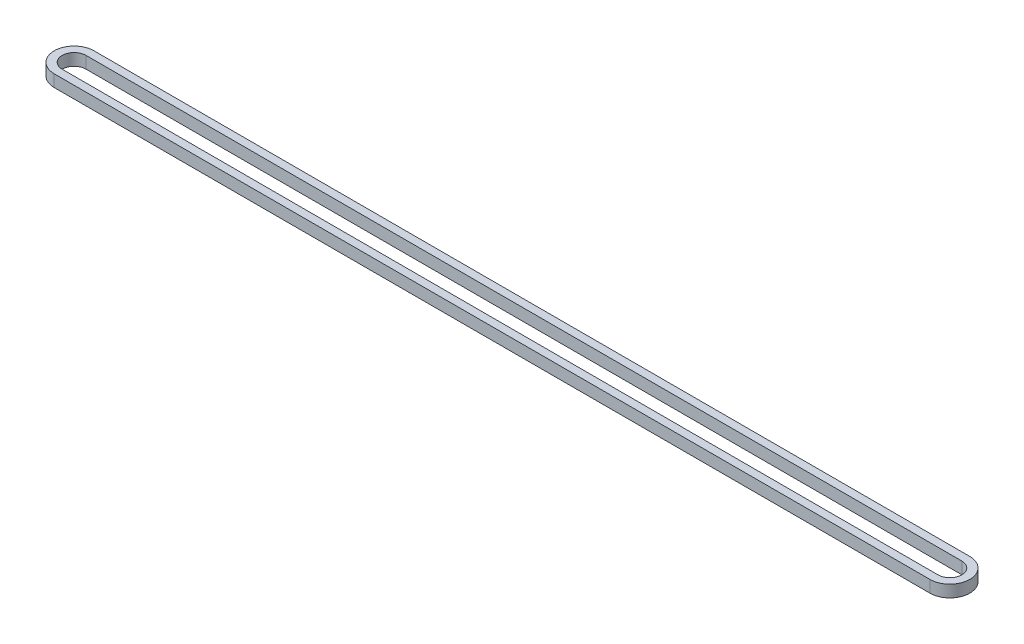
ISO-10303-21;
HEADER;
FILE_DESCRIPTION(('STEP AP214'),'2;1');
FILE_NAME('part.step','',(''),(''),'','','');
FILE_SCHEMA(('AUTOMOTIVE_DESIGN { 1 0 10303 214 1 1 1 1 }'));
ENDSEC;
DATA;
#1=APPLICATION_CONTEXT('core data for automotive mechanical design processes');
#2=APPLICATION_PROTOCOL_DEFINITION('international standard','automotive_design',2000,#1);
#3=PRODUCT_CONTEXT('',#1,'mechanical');
#4=PRODUCT('Part','Part','',(#3));
#5=PRODUCT_RELATED_PRODUCT_CATEGORY('part','',(#4));
#6=PRODUCT_DEFINITION_FORMATION('','',#4);
#7=PRODUCT_DEFINITION_CONTEXT('part definition',#1,'design');
#8=PRODUCT_DEFINITION('design','',#6,#7);
#9=PRODUCT_DEFINITION_SHAPE('','',#8);
#10=(LENGTH_UNIT() NAMED_UNIT(*) SI_UNIT(.MILLI.,.METRE.));
#11=(NAMED_UNIT(*) PLANE_ANGLE_UNIT() SI_UNIT($,.RADIAN.));
#12=(NAMED_UNIT(*) SI_UNIT($,.STERADIAN.) SOLID_ANGLE_UNIT());
#13=UNCERTAINTY_MEASURE_WITH_UNIT(LENGTH_MEASURE(1.E-05),#10,'distance_accuracy_value','');
#14=(GEOMETRIC_REPRESENTATION_CONTEXT(3) GLOBAL_UNCERTAINTY_ASSIGNED_CONTEXT((#13)) GLOBAL_UNIT_ASSIGNED_CONTEXT((#10,
#11,#12)) REPRESENTATION_CONTEXT('',''));
#15=CARTESIAN_POINT('',(0.,0.,0.));
#16=DIRECTION('',(0.,0.,1.));
#17=DIRECTION('',(1.,0.,0.));
#18=AXIS2_PLACEMENT_3D('',#15,#16,#17);
#19=CARTESIAN_POINT('',(0.,3.,0.));
#20=DIRECTION('',(0.,1.,0.));
#21=DIRECTION('',(0.,0.,1.));
#22=AXIS2_PLACEMENT_3D('',#19,#20,#21);
#23=PLANE('',#22);
#24=CARTESIAN_POINT('',(0.,3.,0.));
#25=DIRECTION('',(0.,1.,0.));
#26=DIRECTION('',(1.,0.,0.));
#27=AXIS2_PLACEMENT_3D('',#24,#25,#26);
#28=CIRCLE('',#27,5.);
#29=CARTESIAN_POINT('',(0.,3.,-5.));
#30=VERTEX_POINT('',#29);
#31=CARTESIAN_POINT('',(0.,3.,5.));
#32=VERTEX_POINT('',#31);
#33=EDGE_CURVE('E166',#30,#32,#28,.T.);
#34=ORIENTED_EDGE('',*,*,#33,.T.);
#35=DIRECTION('',(1.,0.,0.));
#36=VECTOR('',#35,1.);
#37=CARTESIAN_POINT('',(0.,3.,5.));
#38=LINE('',#37,#36);
#39=CARTESIAN_POINT('',(220.,3.,5.));
#40=VERTEX_POINT('',#39);
#41=EDGE_CURVE('E169',#32,#40,#38,.T.);
#42=ORIENTED_EDGE('',*,*,#41,.T.);
#43=CARTESIAN_POINT('',(220.,3.,0.));
#44=DIRECTION('',(0.,1.,0.));
#45=DIRECTION('',(1.,0.,0.));
#46=AXIS2_PLACEMENT_3D('',#43,#44,#45);
#47=CIRCLE('',#46,5.);
#48=CARTESIAN_POINT('',(220.,3.,-5.));
#49=VERTEX_POINT('',#48);
#50=EDGE_CURVE('E172',#40,#49,#47,.T.);
#51=ORIENTED_EDGE('',*,*,#50,.T.);
#52=DIRECTION('',(-1.,0.,0.));
#53=VECTOR('',#52,1.);
#54=CARTESIAN_POINT('',(0.,3.,-5.));
#55=LINE('',#54,#53);
#56=EDGE_CURVE('E174',#49,#30,#55,.T.);
#57=ORIENTED_EDGE('',*,*,#56,.T.);
#58=EDGE_LOOP('',(#34,#42,#51,#57));
#59=FACE_BOUND('',#58,.T.);
#60=DIRECTION('',(1.,0.,0.));
#61=VECTOR('',#60,1.);
#62=CARTESIAN_POINT('',(0.,3.,3.));
#63=LINE('',#62,#61);
#64=CARTESIAN_POINT('',(0.,3.,3.));
#65=VERTEX_POINT('',#64);
#66=CARTESIAN_POINT('',(220.,3.,3.));
#67=VERTEX_POINT('',#66);
#68=EDGE_CURVE('E138',#65,#67,#63,.T.);
#69=ORIENTED_EDGE('',*,*,#68,.F.);
#70=CARTESIAN_POINT('',(0.,3.,0.));
#71=DIRECTION('',(0.,1.,0.));
#72=DIRECTION('',(0.,0.,1.));
#73=AXIS2_PLACEMENT_3D('',#70,#71,#72);
#74=CIRCLE('',#73,3.);
#75=CARTESIAN_POINT('',(0.,3.,-3.));
#76=VERTEX_POINT('',#75);
#77=EDGE_CURVE('E130',#76,#65,#74,.T.);
#78=ORIENTED_EDGE('',*,*,#77,.F.);
#79=DIRECTION('',(-1.,0.,0.));
#80=VECTOR('',#79,1.);
#81=CARTESIAN_POINT('',(0.,3.,-3.));
#82=LINE('',#81,#80);
#83=CARTESIAN_POINT('',(220.,3.,-3.));
#84=VERTEX_POINT('',#83);
#85=EDGE_CURVE('E152',#84,#76,#82,.T.);
#86=ORIENTED_EDGE('',*,*,#85,.F.);
#87=CARTESIAN_POINT('',(220.,3.,0.));
#88=DIRECTION('',(0.,1.,0.));
#89=DIRECTION('',(0.,0.,1.));
#90=AXIS2_PLACEMENT_3D('',#87,#88,#89);
#91=CIRCLE('',#90,3.);
#92=EDGE_CURVE('E150',#67,#84,#91,.T.);
#93=ORIENTED_EDGE('',*,*,#92,.F.);
#94=EDGE_LOOP('',(#69,#78,#86,#93));
#95=FACE_BOUND('',#94,.T.);
#96=ADVANCED_FACE('F65',(#59,#95),#23,.T.);
#97=CARTESIAN_POINT('',(0.,0.,0.));
#98=DIRECTION('',(0.,1.,0.));
#99=DIRECTION('',(0.,0.,1.));
#100=AXIS2_PLACEMENT_3D('',#97,#98,#99);
#101=PLANE('',#100);
#102=CARTESIAN_POINT('',(0.,0.,0.));
#103=DIRECTION('',(0.,1.,0.));
#104=DIRECTION('',(1.,0.,0.));
#105=AXIS2_PLACEMENT_3D('',#102,#103,#104);
#106=CIRCLE('',#105,5.);
#107=CARTESIAN_POINT('',(0.,0.,-5.));
#108=VERTEX_POINT('',#107);
#109=CARTESIAN_POINT('',(0.,0.,5.));
#110=VERTEX_POINT('',#109);
#111=EDGE_CURVE('E146',#108,#110,#106,.T.);
#112=ORIENTED_EDGE('',*,*,#111,.F.);
#113=DIRECTION('',(-1.,0.,0.));
#114=VECTOR('',#113,1.);
#115=CARTESIAN_POINT('',(0.,0.,-5.));
#116=LINE('',#115,#114);
#117=CARTESIAN_POINT('',(220.,0.,-5.));
#118=VERTEX_POINT('',#117);
#119=EDGE_CURVE('E170',#118,#108,#116,.T.);
#120=ORIENTED_EDGE('',*,*,#119,.F.);
#121=CARTESIAN_POINT('',(220.,0.,0.));
#122=DIRECTION('',(0.,1.,0.));
#123=DIRECTION('',(1.,0.,0.));
#124=AXIS2_PLACEMENT_3D('',#121,#122,#123);
#125=CIRCLE('',#124,5.);
#126=CARTESIAN_POINT('',(220.,0.,5.));
#127=VERTEX_POINT('',#126);
#128=EDGE_CURVE('E181',#127,#118,#125,.T.);
#129=ORIENTED_EDGE('',*,*,#128,.F.);
#130=DIRECTION('',(1.,0.,0.));
#131=VECTOR('',#130,1.);
#132=CARTESIAN_POINT('',(0.,0.,5.));
#133=LINE('',#132,#131);
#134=EDGE_CURVE('E179',#110,#127,#133,.T.);
#135=ORIENTED_EDGE('',*,*,#134,.F.);
#136=EDGE_LOOP('',(#112,#120,#129,#135));
#137=FACE_BOUND('',#136,.T.);
#138=CARTESIAN_POINT('',(0.,0.,0.));
#139=DIRECTION('',(0.,1.,0.));
#140=DIRECTION('',(0.,0.,1.));
#141=AXIS2_PLACEMENT_3D('',#138,#139,#140);
#142=CIRCLE('',#141,3.);
#143=CARTESIAN_POINT('',(0.,0.,-3.));
#144=VERTEX_POINT('',#143);
#145=CARTESIAN_POINT('',(0.,0.,3.));
#146=VERTEX_POINT('',#145);
#147=EDGE_CURVE('E88',#144,#146,#142,.T.);
#148=ORIENTED_EDGE('',*,*,#147,.T.);
#149=DIRECTION('',(1.,0.,0.));
#150=VECTOR('',#149,1.);
#151=CARTESIAN_POINT('',(0.,0.,3.));
#152=LINE('',#151,#150);
#153=CARTESIAN_POINT('',(220.,0.,3.));
#154=VERTEX_POINT('',#153);
#155=EDGE_CURVE('E145',#146,#154,#152,.T.);
#156=ORIENTED_EDGE('',*,*,#155,.T.);
#157=CARTESIAN_POINT('',(220.,0.,0.));
#158=DIRECTION('',(0.,1.,0.));
#159=DIRECTION('',(0.,0.,1.));
#160=AXIS2_PLACEMENT_3D('',#157,#158,#159);
#161=CIRCLE('',#160,3.);
#162=CARTESIAN_POINT('',(220.,0.,-3.));
#163=VERTEX_POINT('',#162);
#164=EDGE_CURVE('E158',#154,#163,#161,.T.);
#165=ORIENTED_EDGE('',*,*,#164,.T.);
#166=DIRECTION('',(-1.,0.,0.));
#167=VECTOR('',#166,1.);
#168=CARTESIAN_POINT('',(0.,0.,-3.));
#169=LINE('',#168,#167);
#170=EDGE_CURVE('E139',#163,#144,#169,.T.);
#171=ORIENTED_EDGE('',*,*,#170,.T.);
#172=EDGE_LOOP('',(#148,#156,#165,#171));
#173=FACE_BOUND('',#172,.T.);
#174=ADVANCED_FACE('F199',(#137,#173),#101,.F.);
#175=CARTESIAN_POINT('',(0.,3.,0.));
#176=DIRECTION('',(0.,-1.,0.));
#177=DIRECTION('',(0.,0.,-1.));
#178=AXIS2_PLACEMENT_3D('',#175,#176,#177);
#179=CYLINDRICAL_SURFACE('',#178,5.);
#180=ORIENTED_EDGE('',*,*,#111,.T.);
#181=DIRECTION('',(0.,-1.,0.));
#182=VECTOR('',#181,1.);
#183=CARTESIAN_POINT('',(0.,3.,5.));
#184=LINE('',#183,#182);
#185=EDGE_CURVE('E12',#32,#110,#184,.T.);
#186=ORIENTED_EDGE('',*,*,#185,.F.);
#187=ORIENTED_EDGE('',*,*,#33,.F.);
#188=DIRECTION('',(0.,-1.,0.));
#189=VECTOR('',#188,1.);
#190=CARTESIAN_POINT('',(0.,3.,-5.));
#191=LINE('',#190,#189);
#192=EDGE_CURVE('E176',#30,#108,#191,.T.);
#193=ORIENTED_EDGE('',*,*,#192,.T.);
#194=EDGE_LOOP('',(#180,#186,#187,#193));
#195=FACE_BOUND('',#194,.T.);
#196=ADVANCED_FACE('F67',(#195),#179,.T.);
#197=CARTESIAN_POINT('',(0.,3.,5.));
#198=DIRECTION('',(0.,0.,-1.));
#199=DIRECTION('',(-1.,0.,0.));
#200=AXIS2_PLACEMENT_3D('',#197,#198,#199);
#201=PLANE('',#200);
#202=ORIENTED_EDGE('',*,*,#134,.T.);
#203=DIRECTION('',(0.,-1.,0.));
#204=VECTOR('',#203,1.);
#205=CARTESIAN_POINT('',(220.,3.,5.));
#206=LINE('',#205,#204);
#207=EDGE_CURVE('E73',#40,#127,#206,.T.);
#208=ORIENTED_EDGE('',*,*,#207,.F.);
#209=ORIENTED_EDGE('',*,*,#41,.F.);
#210=ORIENTED_EDGE('',*,*,#185,.T.);
#211=EDGE_LOOP('',(#202,#208,#209,#210));
#212=FACE_BOUND('',#211,.T.);
#213=ADVANCED_FACE('F209',(#212),#201,.F.);
#214=CARTESIAN_POINT('',(220.,3.,0.));
#215=DIRECTION('',(0.,-1.,0.));
#216=DIRECTION('',(0.,0.,-1.));
#217=AXIS2_PLACEMENT_3D('',#214,#215,#216);
#218=CYLINDRICAL_SURFACE('',#217,5.);
#219=ORIENTED_EDGE('',*,*,#128,.T.);
#220=DIRECTION('',(0.,-1.,0.));
#221=VECTOR('',#220,1.);
#222=CARTESIAN_POINT('',(220.,3.,-5.));
#223=LINE('',#222,#221);
#224=EDGE_CURVE('E186',#49,#118,#223,.T.);
#225=ORIENTED_EDGE('',*,*,#224,.F.);
#226=ORIENTED_EDGE('',*,*,#50,.F.);
#227=ORIENTED_EDGE('',*,*,#207,.T.);
#228=EDGE_LOOP('',(#219,#225,#226,#227));
#229=FACE_BOUND('',#228,.T.);
#230=ADVANCED_FACE('F193',(#229),#218,.T.);
#231=CARTESIAN_POINT('',(0.,3.,-5.));
#232=DIRECTION('',(0.,0.,1.));
#233=DIRECTION('',(1.,0.,0.));
#234=AXIS2_PLACEMENT_3D('',#231,#232,#233);
#235=PLANE('',#234);
#236=ORIENTED_EDGE('',*,*,#119,.T.);
#237=ORIENTED_EDGE('',*,*,#192,.F.);
#238=ORIENTED_EDGE('',*,*,#56,.F.);
#239=ORIENTED_EDGE('',*,*,#224,.T.);
#240=EDGE_LOOP('',(#236,#237,#238,#239));
#241=FACE_BOUND('',#240,.T.);
#242=ADVANCED_FACE('F203',(#241),#235,.F.);
#243=CARTESIAN_POINT('',(0.,3.,0.));
#244=DIRECTION('',(0.,-1.,0.));
#245=DIRECTION('',(0.,0.,-1.));
#246=AXIS2_PLACEMENT_3D('',#243,#244,#245);
#247=CYLINDRICAL_SURFACE('',#246,3.);
#248=ORIENTED_EDGE('',*,*,#147,.F.);
#249=DIRECTION('',(0.,-1.,0.));
#250=VECTOR('',#249,1.);
#251=CARTESIAN_POINT('',(0.,3.,-3.));
#252=LINE('',#251,#250);
#253=EDGE_CURVE('E134',#76,#144,#252,.T.);
#254=ORIENTED_EDGE('',*,*,#253,.F.);
#255=ORIENTED_EDGE('',*,*,#77,.T.);
#256=DIRECTION('',(0.,-1.,0.));
#257=VECTOR('',#256,1.);
#258=CARTESIAN_POINT('',(0.,3.,3.));
#259=LINE('',#258,#257);
#260=EDGE_CURVE('E133',#65,#146,#259,.T.);
#261=ORIENTED_EDGE('',*,*,#260,.T.);
#262=EDGE_LOOP('',(#248,#254,#255,#261));
#263=FACE_BOUND('',#262,.T.);
#264=ADVANCED_FACE('F132',(#263),#247,.F.);
#265=CARTESIAN_POINT('',(0.,3.,3.));
#266=DIRECTION('',(0.,0.,-1.));
#267=DIRECTION('',(-1.,0.,0.));
#268=AXIS2_PLACEMENT_3D('',#265,#266,#267);
#269=PLANE('',#268);
#270=ORIENTED_EDGE('',*,*,#155,.F.);
#271=ORIENTED_EDGE('',*,*,#260,.F.);
#272=ORIENTED_EDGE('',*,*,#68,.T.);
#273=DIRECTION('',(0.,-1.,0.));
#274=VECTOR('',#273,1.);
#275=CARTESIAN_POINT('',(220.,3.,3.));
#276=LINE('',#275,#274);
#277=EDGE_CURVE('E147',#67,#154,#276,.T.);
#278=ORIENTED_EDGE('',*,*,#277,.T.);
#279=EDGE_LOOP('',(#270,#271,#272,#278));
#280=FACE_BOUND('',#279,.T.);
#281=ADVANCED_FACE('F142',(#280),#269,.T.);
#282=CARTESIAN_POINT('',(220.,3.,0.));
#283=DIRECTION('',(0.,-1.,0.));
#284=DIRECTION('',(0.,0.,-1.));
#285=AXIS2_PLACEMENT_3D('',#282,#283,#284);
#286=CYLINDRICAL_SURFACE('',#285,3.);
#287=ORIENTED_EDGE('',*,*,#164,.F.);
#288=ORIENTED_EDGE('',*,*,#277,.F.);
#289=ORIENTED_EDGE('',*,*,#92,.T.);
#290=DIRECTION('',(0.,-1.,0.));
#291=VECTOR('',#290,1.);
#292=CARTESIAN_POINT('',(220.,3.,-3.));
#293=LINE('',#292,#291);
#294=EDGE_CURVE('E80',#84,#163,#293,.T.);
#295=ORIENTED_EDGE('',*,*,#294,.T.);
#296=EDGE_LOOP('',(#287,#288,#289,#295));
#297=FACE_BOUND('',#296,.T.);
#298=ADVANCED_FACE('F232',(#297),#286,.F.);
#299=CARTESIAN_POINT('',(0.,3.,-3.));
#300=DIRECTION('',(0.,0.,1.));
#301=DIRECTION('',(1.,0.,0.));
#302=AXIS2_PLACEMENT_3D('',#299,#300,#301);
#303=PLANE('',#302);
#304=ORIENTED_EDGE('',*,*,#170,.F.);
#305=ORIENTED_EDGE('',*,*,#294,.F.);
#306=ORIENTED_EDGE('',*,*,#85,.T.);
#307=ORIENTED_EDGE('',*,*,#253,.T.);
#308=EDGE_LOOP('',(#304,#305,#306,#307));
#309=FACE_BOUND('',#308,.T.);
#310=ADVANCED_FACE('F236',(#309),#303,.T.);
#311=CLOSED_SHELL('',(#96,#174,#196,#213,#230,#242,#264,#281,#298,#310));
#312=MANIFOLD_SOLID_BREP('B2',#311);
#313=ADVANCED_BREP_SHAPE_REPRESENTATION('',(#18,#312),#14);
#314=SHAPE_DEFINITION_REPRESENTATION(#9,#313);
ENDSEC;
END-ISO-10303-21;
